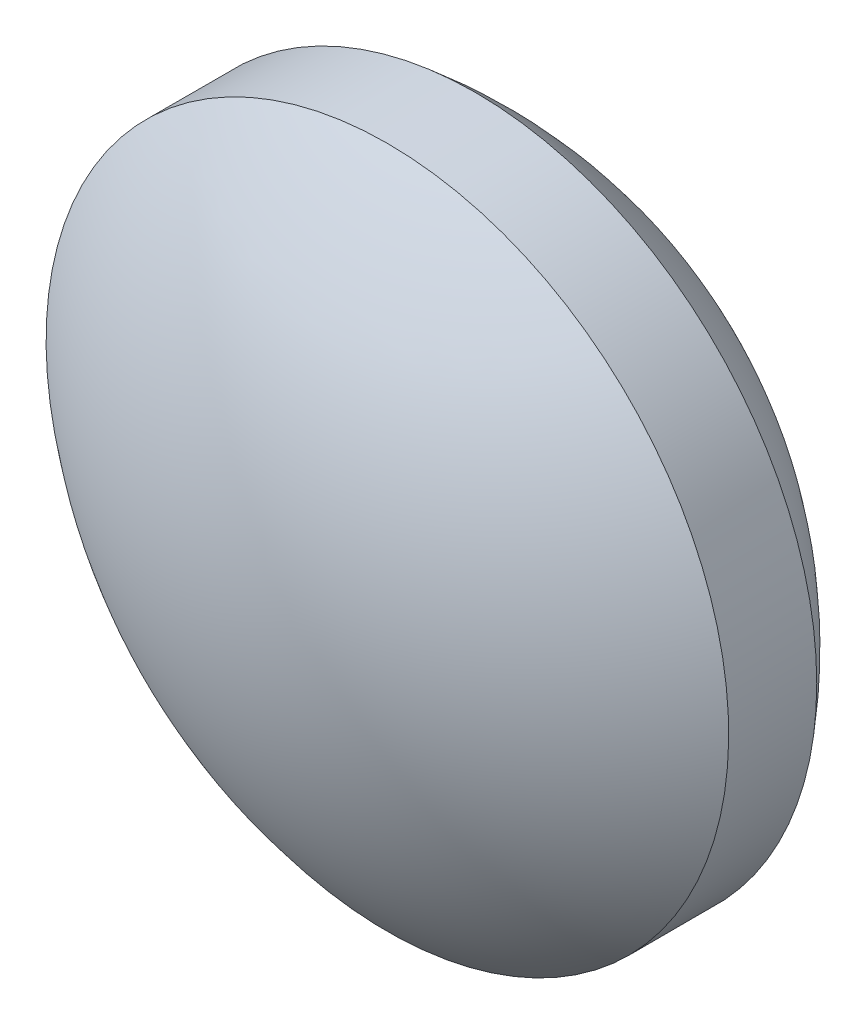
ISO-10303-21;
HEADER;
FILE_DESCRIPTION(('STEP AP214'),'2;1');
FILE_NAME('part.step','',(''),(''),'','','');
FILE_SCHEMA(('AUTOMOTIVE_DESIGN { 1 0 10303 214 1 1 1 1 }'));
ENDSEC;
DATA;
#1=APPLICATION_CONTEXT('core data for automotive mechanical design processes');
#2=APPLICATION_PROTOCOL_DEFINITION('international standard','automotive_design',2000,#1);
#3=PRODUCT_CONTEXT('',#1,'mechanical');
#4=PRODUCT('Part','Part','',(#3));
#5=PRODUCT_RELATED_PRODUCT_CATEGORY('part','',(#4));
#6=PRODUCT_DEFINITION_FORMATION('','',#4);
#7=PRODUCT_DEFINITION_CONTEXT('part definition',#1,'design');
#8=PRODUCT_DEFINITION('design','',#6,#7);
#9=PRODUCT_DEFINITION_SHAPE('','',#8);
#10=(LENGTH_UNIT() NAMED_UNIT(*) SI_UNIT(.MILLI.,.METRE.));
#11=(NAMED_UNIT(*) PLANE_ANGLE_UNIT() SI_UNIT($,.RADIAN.));
#12=(NAMED_UNIT(*) SI_UNIT($,.STERADIAN.) SOLID_ANGLE_UNIT());
#13=UNCERTAINTY_MEASURE_WITH_UNIT(LENGTH_MEASURE(1.E-05),#10,'distance_accuracy_value','');
#14=(GEOMETRIC_REPRESENTATION_CONTEXT(3) GLOBAL_UNCERTAINTY_ASSIGNED_CONTEXT((#13)) GLOBAL_UNIT_ASSIGNED_CONTEXT((#10,
#11,#12)) REPRESENTATION_CONTEXT('',''));
#15=CARTESIAN_POINT('',(0.,0.,0.));
#16=DIRECTION('',(0.,0.,1.));
#17=DIRECTION('',(1.,0.,0.));
#18=AXIS2_PLACEMENT_3D('',#15,#16,#17);
#19=CARTESIAN_POINT('',(0.,0.,2.65980616494114));
#20=DIRECTION('',(0.,0.,-1.));
#21=DIRECTION('',(0.,-1.,0.));
#22=AXIS2_PLACEMENT_3D('',#19,#20,#21);
#23=SPHERICAL_SURFACE('',#22,5.);
#24=CARTESIAN_POINT('',(0.,0.,-0.5));
#25=DIRECTION('',(0.,0.,-1.));
#26=DIRECTION('',(0.,1.,0.));
#27=AXIS2_PLACEMENT_3D('',#24,#25,#26);
#28=CIRCLE('',#27,3.875);
#29=CARTESIAN_POINT('',(0.,3.875,-0.5));
#30=VERTEX_POINT('',#29);
#31=EDGE_CURVE('E10',#30,#30,#28,.T.);
#32=ORIENTED_EDGE('',*,*,#31,.T.);
#33=EDGE_LOOP('',(#32));
#34=FACE_BOUND('',#33,.T.);
#35=ADVANCED_FACE('F43',(#34),#23,.T.);
#36=CARTESIAN_POINT('',(0.,0.,0.));
#37=DIRECTION('',(0.,0.,-1.));
#38=DIRECTION('',(0.,1.,0.));
#39=AXIS2_PLACEMENT_3D('',#36,#37,#38);
#40=CYLINDRICAL_SURFACE('',#39,3.875);
#41=ORIENTED_EDGE('',*,*,#31,.F.);
#42=EDGE_LOOP('',(#41));
#43=FACE_BOUND('',#42,.T.);
#44=CARTESIAN_POINT('',(0.,0.,0.5));
#45=DIRECTION('',(0.,0.,-1.));
#46=DIRECTION('',(0.,1.,0.));
#47=AXIS2_PLACEMENT_3D('',#44,#45,#46);
#48=CIRCLE('',#47,3.875);
#49=CARTESIAN_POINT('',(0.,3.875,0.5));
#50=VERTEX_POINT('',#49);
#51=EDGE_CURVE('E50',#50,#50,#48,.T.);
#52=ORIENTED_EDGE('',*,*,#51,.T.);
#53=EDGE_LOOP('',(#52));
#54=FACE_BOUND('',#53,.T.);
#55=ADVANCED_FACE('F57',(#43,#54),#40,.T.);
#56=CARTESIAN_POINT('',(0.,0.,-4.08087055045217));
#57=DIRECTION('',(0.,0.,-1.));
#58=DIRECTION('',(0.,1.,0.));
#59=AXIS2_PLACEMENT_3D('',#56,#57,#58);
#60=SPHERICAL_SURFACE('',#59,6.);
#61=ORIENTED_EDGE('',*,*,#51,.F.);
#62=EDGE_LOOP('',(#61));
#63=FACE_BOUND('',#62,.T.);
#64=ADVANCED_FACE('F59',(#63),#60,.T.);
#65=CLOSED_SHELL('',(#35,#55,#64));
#66=MANIFOLD_SOLID_BREP('B2',#65);
#67=ADVANCED_BREP_SHAPE_REPRESENTATION('',(#18,#66),#14);
#68=SHAPE_DEFINITION_REPRESENTATION(#9,#67);
ENDSEC;
END-ISO-10303-21;
